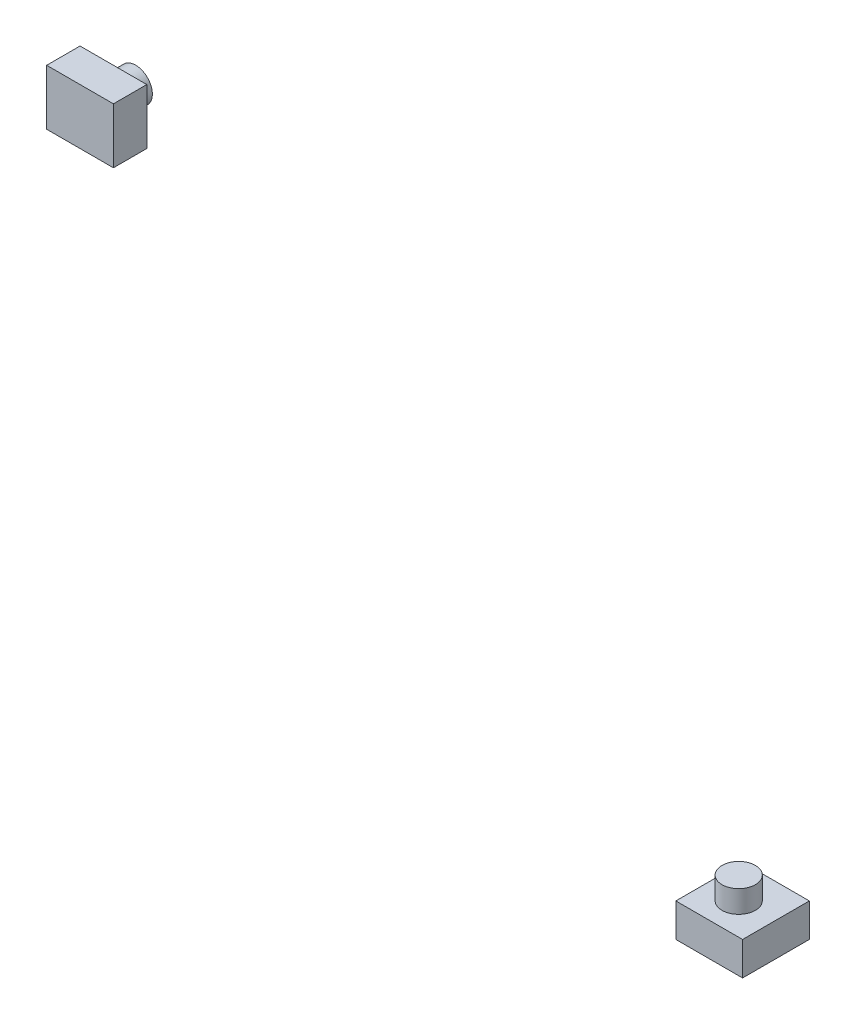
ISO-10303-21;
HEADER;
FILE_DESCRIPTION(('STEP AP214'),'2;1');
FILE_NAME('part.step','',(''),(''),'','','');
FILE_SCHEMA(('AUTOMOTIVE_DESIGN { 1 0 10303 214 1 1 1 1 }'));
ENDSEC;
DATA;
#1=APPLICATION_CONTEXT('core data for automotive mechanical design processes');
#2=APPLICATION_PROTOCOL_DEFINITION('international standard','automotive_design',2000,#1);
#3=PRODUCT_CONTEXT('',#1,'mechanical');
#4=PRODUCT('Part','Part','',(#3));
#5=PRODUCT_RELATED_PRODUCT_CATEGORY('part','',(#4));
#6=PRODUCT_DEFINITION_FORMATION('','',#4);
#7=PRODUCT_DEFINITION_CONTEXT('part definition',#1,'design');
#8=PRODUCT_DEFINITION('design','',#6,#7);
#9=PRODUCT_DEFINITION_SHAPE('','',#8);
#10=(LENGTH_UNIT() NAMED_UNIT(*) SI_UNIT(.MILLI.,.METRE.));
#11=(NAMED_UNIT(*) PLANE_ANGLE_UNIT() SI_UNIT($,.RADIAN.));
#12=(NAMED_UNIT(*) SI_UNIT($,.STERADIAN.) SOLID_ANGLE_UNIT());
#13=UNCERTAINTY_MEASURE_WITH_UNIT(LENGTH_MEASURE(1.E-05),#10,'distance_accuracy_value','');
#14=(GEOMETRIC_REPRESENTATION_CONTEXT(3) GLOBAL_UNCERTAINTY_ASSIGNED_CONTEXT((#13)) GLOBAL_UNIT_ASSIGNED_CONTEXT((#10,
#11,#12)) REPRESENTATION_CONTEXT('',''));
#15=CARTESIAN_POINT('',(0.,0.,0.));
#16=DIRECTION('',(0.,0.,1.));
#17=DIRECTION('',(1.,0.,0.));
#18=AXIS2_PLACEMENT_3D('',#15,#16,#17);
#19=CARTESIAN_POINT('',(-533.4,29.4639999999999,-176.53));
#20=DIRECTION('',(0.,0.,-1.));
#21=DIRECTION('',(-1.,0.,0.));
#22=AXIS2_PLACEMENT_3D('',#19,#20,#21);
#23=CYLINDRICAL_SURFACE('',#22,9.52500000000002);
#24=CARTESIAN_POINT('',(-533.4,29.4639999999999,-176.53));
#25=DIRECTION('',(0.,0.,1.));
#26=DIRECTION('',(1.,0.,0.));
#27=AXIS2_PLACEMENT_3D('',#24,#25,#26);
#28=CIRCLE('',#27,9.52500000000002);
#29=CARTESIAN_POINT('',(-523.875,29.4639999999999,-176.53));
#30=VERTEX_POINT('',#29);
#31=EDGE_CURVE('E12',#30,#30,#28,.T.);
#32=ORIENTED_EDGE('',*,*,#31,.F.);
#33=EDGE_LOOP('',(#32));
#34=FACE_BOUND('',#33,.T.);
#35=CARTESIAN_POINT('',(-533.4,29.4639999999999,-189.23));
#36=DIRECTION('',(0.,0.,1.));
#37=DIRECTION('',(1.,0.,0.));
#38=AXIS2_PLACEMENT_3D('',#35,#36,#37);
#39=CIRCLE('',#38,9.52500000000002);
#40=CARTESIAN_POINT('',(-523.875,29.4639999999999,-189.23));
#41=VERTEX_POINT('',#40);
#42=EDGE_CURVE('E44',#41,#41,#39,.T.);
#43=ORIENTED_EDGE('',*,*,#42,.T.);
#44=EDGE_LOOP('',(#43));
#45=FACE_BOUND('',#44,.T.);
#46=ADVANCED_FACE('F41',(#34,#45),#23,.T.);
#47=CARTESIAN_POINT('',(-533.4,29.4639999999999,-189.23));
#48=DIRECTION('',(0.,0.,1.));
#49=DIRECTION('',(1.,0.,0.));
#50=AXIS2_PLACEMENT_3D('',#47,#48,#49);
#51=PLANE('',#50);
#52=ORIENTED_EDGE('',*,*,#42,.F.);
#53=EDGE_LOOP('',(#52));
#54=FACE_BOUND('',#53,.T.);
#55=ADVANCED_FACE('F120',(#54),#51,.F.);
#56=CARTESIAN_POINT('',(-514.35,13.6466217693397,-176.53));
#57=DIRECTION('',(0.,0.,1.));
#58=DIRECTION('',(1.,0.,0.));
#59=AXIS2_PLACEMENT_3D('',#56,#57,#58);
#60=PLANE('',#59);
#61=DIRECTION('',(0.,1.,0.));
#62=VECTOR('',#61,1.);
#63=CARTESIAN_POINT('',(-514.35,45.2813782306603,-176.53));
#64=LINE('',#63,#62);
#65=CARTESIAN_POINT('',(-514.35,13.6466217693397,-176.53));
#66=VERTEX_POINT('',#65);
#67=CARTESIAN_POINT('',(-514.35,45.2813782306603,-176.53));
#68=VERTEX_POINT('',#67);
#69=EDGE_CURVE('E108',#66,#68,#64,.T.);
#70=ORIENTED_EDGE('',*,*,#69,.F.);
#71=DIRECTION('',(1.,0.,0.));
#72=VECTOR('',#71,1.);
#73=CARTESIAN_POINT('',(-552.45,13.6466217693397,-176.53));
#74=LINE('',#73,#72);
#75=CARTESIAN_POINT('',(-552.45,13.6466217693397,-176.53));
#76=VERTEX_POINT('',#75);
#77=EDGE_CURVE('E80',#76,#66,#74,.T.);
#78=ORIENTED_EDGE('',*,*,#77,.F.);
#79=DIRECTION('',(0.,-1.,0.));
#80=VECTOR('',#79,1.);
#81=CARTESIAN_POINT('',(-552.45,45.2813782306603,-176.53));
#82=LINE('',#81,#80);
#83=CARTESIAN_POINT('',(-552.45,45.2813782306603,-176.53));
#84=VERTEX_POINT('',#83);
#85=EDGE_CURVE('E74',#84,#76,#82,.T.);
#86=ORIENTED_EDGE('',*,*,#85,.F.);
#87=DIRECTION('',(-1.,0.,0.));
#88=VECTOR('',#87,1.);
#89=CARTESIAN_POINT('',(-552.45,45.2813782306603,-176.53));
#90=LINE('',#89,#88);
#91=EDGE_CURVE('E98',#68,#84,#90,.T.);
#92=ORIENTED_EDGE('',*,*,#91,.F.);
#93=EDGE_LOOP('',(#70,#78,#86,#92));
#94=FACE_BOUND('',#93,.T.);
#95=ORIENTED_EDGE('',*,*,#31,.T.);
#96=EDGE_LOOP('',(#95));
#97=FACE_BOUND('',#96,.T.);
#98=ADVANCED_FACE('F122',(#94,#97),#60,.F.);
#99=CARTESIAN_POINT('',(-514.35,45.2813782306603,-157.48));
#100=DIRECTION('',(-1.,0.,0.));
#101=DIRECTION('',(0.,0.,1.));
#102=AXIS2_PLACEMENT_3D('',#99,#100,#101);
#103=PLANE('',#102);
#104=ORIENTED_EDGE('',*,*,#69,.T.);
#105=DIRECTION('',(0.,0.,-1.));
#106=VECTOR('',#105,1.);
#107=CARTESIAN_POINT('',(-514.35,45.2813782306603,-157.48));
#108=LINE('',#107,#106);
#109=CARTESIAN_POINT('',(-514.35,45.2813782306603,-157.48));
#110=VERTEX_POINT('',#109);
#111=EDGE_CURVE('E99',#110,#68,#108,.T.);
#112=ORIENTED_EDGE('',*,*,#111,.F.);
#113=DIRECTION('',(0.,1.,0.));
#114=VECTOR('',#113,1.);
#115=CARTESIAN_POINT('',(-514.35,45.2813782306603,-157.48));
#116=LINE('',#115,#114);
#117=CARTESIAN_POINT('',(-514.35,13.6466217693397,-157.48));
#118=VERTEX_POINT('',#117);
#119=EDGE_CURVE('E93',#118,#110,#116,.T.);
#120=ORIENTED_EDGE('',*,*,#119,.F.);
#121=DIRECTION('',(0.,0.,-1.));
#122=VECTOR('',#121,1.);
#123=CARTESIAN_POINT('',(-514.35,13.6466217693397,-157.48));
#124=LINE('',#123,#122);
#125=EDGE_CURVE('E104',#118,#66,#124,.T.);
#126=ORIENTED_EDGE('',*,*,#125,.T.);
#127=EDGE_LOOP('',(#104,#112,#120,#126));
#128=FACE_BOUND('',#127,.T.);
#129=ADVANCED_FACE('F127',(#128),#103,.F.);
#130=CARTESIAN_POINT('',(-552.45,45.2813782306603,-157.48));
#131=DIRECTION('',(0.,-1.,0.));
#132=DIRECTION('',(1.,0.,0.));
#133=AXIS2_PLACEMENT_3D('',#130,#131,#132);
#134=PLANE('',#133);
#135=ORIENTED_EDGE('',*,*,#91,.T.);
#136=DIRECTION('',(0.,0.,-1.));
#137=VECTOR('',#136,1.);
#138=CARTESIAN_POINT('',(-552.45,45.2813782306603,-157.48));
#139=LINE('',#138,#137);
#140=CARTESIAN_POINT('',(-552.45,45.2813782306603,-157.48));
#141=VERTEX_POINT('',#140);
#142=EDGE_CURVE('E96',#141,#84,#139,.T.);
#143=ORIENTED_EDGE('',*,*,#142,.F.);
#144=DIRECTION('',(-1.,0.,0.));
#145=VECTOR('',#144,1.);
#146=CARTESIAN_POINT('',(-552.45,45.2813782306603,-157.48));
#147=LINE('',#146,#145);
#148=EDGE_CURVE('E88',#110,#141,#147,.T.);
#149=ORIENTED_EDGE('',*,*,#148,.F.);
#150=ORIENTED_EDGE('',*,*,#111,.T.);
#151=EDGE_LOOP('',(#135,#143,#149,#150));
#152=FACE_BOUND('',#151,.T.);
#153=ADVANCED_FACE('F97',(#152),#134,.F.);
#154=CARTESIAN_POINT('',(-552.45,45.2813782306603,-157.48));
#155=DIRECTION('',(1.,0.,0.));
#156=DIRECTION('',(0.,0.,-1.));
#157=AXIS2_PLACEMENT_3D('',#154,#155,#156);
#158=PLANE('',#157);
#159=ORIENTED_EDGE('',*,*,#85,.T.);
#160=DIRECTION('',(0.,0.,-1.));
#161=VECTOR('',#160,1.);
#162=CARTESIAN_POINT('',(-552.45,13.6466217693397,-157.48));
#163=LINE('',#162,#161);
#164=CARTESIAN_POINT('',(-552.45,13.6466217693397,-157.48));
#165=VERTEX_POINT('',#164);
#166=EDGE_CURVE('E100',#165,#76,#163,.T.);
#167=ORIENTED_EDGE('',*,*,#166,.F.);
#168=DIRECTION('',(0.,-1.,0.));
#169=VECTOR('',#168,1.);
#170=CARTESIAN_POINT('',(-552.45,45.2813782306603,-157.48));
#171=LINE('',#170,#169);
#172=EDGE_CURVE('E91',#141,#165,#171,.T.);
#173=ORIENTED_EDGE('',*,*,#172,.F.);
#174=ORIENTED_EDGE('',*,*,#142,.T.);
#175=EDGE_LOOP('',(#159,#167,#173,#174));
#176=FACE_BOUND('',#175,.T.);
#177=ADVANCED_FACE('F102',(#176),#158,.F.);
#178=CARTESIAN_POINT('',(-552.45,13.6466217693397,-157.48));
#179=DIRECTION('',(0.,1.,0.));
#180=DIRECTION('',(0.,0.,1.));
#181=AXIS2_PLACEMENT_3D('',#178,#179,#180);
#182=PLANE('',#181);
#183=ORIENTED_EDGE('',*,*,#77,.T.);
#184=ORIENTED_EDGE('',*,*,#125,.F.);
#185=DIRECTION('',(1.,0.,0.));
#186=VECTOR('',#185,1.);
#187=CARTESIAN_POINT('',(-552.45,13.6466217693397,-157.48));
#188=LINE('',#187,#186);
#189=EDGE_CURVE('E57',#165,#118,#188,.T.);
#190=ORIENTED_EDGE('',*,*,#189,.F.);
#191=ORIENTED_EDGE('',*,*,#166,.T.);
#192=EDGE_LOOP('',(#183,#184,#190,#191));
#193=FACE_BOUND('',#192,.T.);
#194=ADVANCED_FACE('F139',(#193),#182,.F.);
#195=CARTESIAN_POINT('',(-514.35,13.6466217693397,-157.48));
#196=DIRECTION('',(0.,0.,1.));
#197=DIRECTION('',(1.,0.,0.));
#198=AXIS2_PLACEMENT_3D('',#195,#196,#197);
#199=PLANE('',#198);
#200=ORIENTED_EDGE('',*,*,#119,.T.);
#201=ORIENTED_EDGE('',*,*,#148,.T.);
#202=ORIENTED_EDGE('',*,*,#172,.T.);
#203=ORIENTED_EDGE('',*,*,#189,.T.);
#204=EDGE_LOOP('',(#200,#201,#202,#203));
#205=FACE_BOUND('',#204,.T.);
#206=ADVANCED_FACE('F89',(#205),#199,.T.);
#207=CLOSED_SHELL('',(#46,#55,#98,#129,#153,#177,#194,#206));
#208=MANIFOLD_SOLID_BREP('B2',#207);
#209=CARTESIAN_POINT('',(0.,-12.7,0.));
#210=DIRECTION('',(0.,1.,0.));
#211=DIRECTION('',(0.,0.,1.));
#212=AXIS2_PLACEMENT_3D('',#209,#210,#211);
#213=CYLINDRICAL_SURFACE('',#212,9.525);
#214=CARTESIAN_POINT('',(0.,-12.7,0.));
#215=DIRECTION('',(0.,-1.,0.));
#216=DIRECTION('',(0.,0.,-1.));
#217=AXIS2_PLACEMENT_3D('',#214,#215,#216);
#218=CIRCLE('',#217,9.525);
#219=CARTESIAN_POINT('',(0.,-12.7,-9.525));
#220=VERTEX_POINT('',#219);
#221=EDGE_CURVE('E203',#220,#220,#218,.F.);
#222=ORIENTED_EDGE('',*,*,#221,.T.);
#223=EDGE_LOOP('',(#222));
#224=FACE_BOUND('',#223,.T.);
#225=CARTESIAN_POINT('',(0.,0.,0.));
#226=DIRECTION('',(0.,1.,0.));
#227=DIRECTION('',(0.,0.,1.));
#228=AXIS2_PLACEMENT_3D('',#225,#226,#227);
#229=CIRCLE('',#228,9.525);
#230=CARTESIAN_POINT('',(0.,0.,9.525));
#231=VERTEX_POINT('',#230);
#232=EDGE_CURVE('E39',#231,#231,#229,.T.);
#233=ORIENTED_EDGE('',*,*,#232,.F.);
#234=EDGE_LOOP('',(#233));
#235=FACE_BOUND('',#234,.T.);
#236=ADVANCED_FACE('F195',(#224,#235),#213,.T.);
#237=CARTESIAN_POINT('',(0.,0.,0.));
#238=DIRECTION('',(0.,1.,0.));
#239=DIRECTION('',(0.,0.,1.));
#240=AXIS2_PLACEMENT_3D('',#237,#238,#239);
#241=PLANE('',#240);
#242=ORIENTED_EDGE('',*,*,#232,.T.);
#243=EDGE_LOOP('',(#242));
#244=FACE_BOUND('',#243,.T.);
#245=ADVANCED_FACE('F292',(#244),#241,.T.);
#246=CARTESIAN_POINT('',(20.2418351148613,-31.75,18.0318031492346));
#247=DIRECTION('',(-1.,0.,0.));
#248=DIRECTION('',(0.,0.,1.));
#249=AXIS2_PLACEMENT_3D('',#246,#247,#248);
#250=PLANE('',#249);
#251=DIRECTION('',(0.,0.,1.));
#252=VECTOR('',#251,1.);
#253=CARTESIAN_POINT('',(20.2418351148613,-12.7,18.0318031492346));
#254=LINE('',#253,#252);
#255=CARTESIAN_POINT('',(20.2418351148613,-12.7,-20.0681968507654));
#256=VERTEX_POINT('',#255);
#257=CARTESIAN_POINT('',(20.2418351148613,-12.7,18.0318031492346));
#258=VERTEX_POINT('',#257);
#259=EDGE_CURVE('E262',#256,#258,#254,.T.);
#260=ORIENTED_EDGE('',*,*,#259,.T.);
#261=DIRECTION('',(0.,1.,0.));
#262=VECTOR('',#261,1.);
#263=CARTESIAN_POINT('',(20.2418351148613,-31.75,18.0318031492346));
#264=LINE('',#263,#262);
#265=CARTESIAN_POINT('',(20.2418351148613,-31.75,18.0318031492346));
#266=VERTEX_POINT('',#265);
#267=EDGE_CURVE('E253',#266,#258,#264,.T.);
#268=ORIENTED_EDGE('',*,*,#267,.F.);
#269=DIRECTION('',(0.,0.,1.));
#270=VECTOR('',#269,1.);
#271=CARTESIAN_POINT('',(20.2418351148613,-31.75,18.0318031492346));
#272=LINE('',#271,#270);
#273=CARTESIAN_POINT('',(20.2418351148613,-31.75,-20.0681968507654));
#274=VERTEX_POINT('',#273);
#275=EDGE_CURVE('E247',#274,#266,#272,.T.);
#276=ORIENTED_EDGE('',*,*,#275,.F.);
#277=DIRECTION('',(0.,1.,0.));
#278=VECTOR('',#277,1.);
#279=CARTESIAN_POINT('',(20.2418351148613,-31.75,-20.0681968507654));
#280=LINE('',#279,#278);
#281=EDGE_CURVE('E258',#274,#256,#280,.T.);
#282=ORIENTED_EDGE('',*,*,#281,.T.);
#283=EDGE_LOOP('',(#260,#268,#276,#282));
#284=FACE_BOUND('',#283,.T.);
#285=ADVANCED_FACE('F281',(#284),#250,.F.);
#286=CARTESIAN_POINT('',(-17.8581648851387,-31.75,18.0318031492346));
#287=DIRECTION('',(0.,0.,-1.));
#288=DIRECTION('',(-1.,0.,0.));
#289=AXIS2_PLACEMENT_3D('',#286,#287,#288);
#290=PLANE('',#289);
#291=DIRECTION('',(-1.,0.,0.));
#292=VECTOR('',#291,1.);
#293=CARTESIAN_POINT('',(-17.8581648851387,-12.7,18.0318031492346));
#294=LINE('',#293,#292);
#295=CARTESIAN_POINT('',(-17.8581648851387,-12.7,18.0318031492346));
#296=VERTEX_POINT('',#295);
#297=EDGE_CURVE('E252',#258,#296,#294,.T.);
#298=ORIENTED_EDGE('',*,*,#297,.T.);
#299=DIRECTION('',(0.,1.,0.));
#300=VECTOR('',#299,1.);
#301=CARTESIAN_POINT('',(-17.8581648851387,-31.75,18.0318031492346));
#302=LINE('',#301,#300);
#303=CARTESIAN_POINT('',(-17.8581648851387,-31.75,18.0318031492346));
#304=VERTEX_POINT('',#303);
#305=EDGE_CURVE('E250',#304,#296,#302,.T.);
#306=ORIENTED_EDGE('',*,*,#305,.F.);
#307=DIRECTION('',(-1.,0.,0.));
#308=VECTOR('',#307,1.);
#309=CARTESIAN_POINT('',(-17.8581648851387,-31.75,18.0318031492346));
#310=LINE('',#309,#308);
#311=EDGE_CURVE('E242',#266,#304,#310,.T.);
#312=ORIENTED_EDGE('',*,*,#311,.F.);
#313=ORIENTED_EDGE('',*,*,#267,.T.);
#314=EDGE_LOOP('',(#298,#306,#312,#313));
#315=FACE_BOUND('',#314,.T.);
#316=ADVANCED_FACE('F251',(#315),#290,.F.);
#317=CARTESIAN_POINT('',(-17.8581648851387,-31.75,18.0318031492346));
#318=DIRECTION('',(1.,0.,0.));
#319=DIRECTION('',(0.,0.,-1.));
#320=AXIS2_PLACEMENT_3D('',#317,#318,#319);
#321=PLANE('',#320);
#322=DIRECTION('',(0.,0.,-1.));
#323=VECTOR('',#322,1.);
#324=CARTESIAN_POINT('',(-17.8581648851387,-12.7,18.0318031492346));
#325=LINE('',#324,#323);
#326=CARTESIAN_POINT('',(-17.8581648851387,-12.7,-20.0681968507654));
#327=VERTEX_POINT('',#326);
#328=EDGE_CURVE('E228',#296,#327,#325,.T.);
#329=ORIENTED_EDGE('',*,*,#328,.T.);
#330=DIRECTION('',(0.,1.,0.));
#331=VECTOR('',#330,1.);
#332=CARTESIAN_POINT('',(-17.8581648851387,-31.75,-20.0681968507654));
#333=LINE('',#332,#331);
#334=CARTESIAN_POINT('',(-17.8581648851387,-31.75,-20.0681968507654));
#335=VERTEX_POINT('',#334);
#336=EDGE_CURVE('E254',#335,#327,#333,.T.);
#337=ORIENTED_EDGE('',*,*,#336,.F.);
#338=DIRECTION('',(0.,0.,-1.));
#339=VECTOR('',#338,1.);
#340=CARTESIAN_POINT('',(-17.8581648851387,-31.75,18.0318031492346));
#341=LINE('',#340,#339);
#342=EDGE_CURVE('E245',#304,#335,#341,.T.);
#343=ORIENTED_EDGE('',*,*,#342,.F.);
#344=ORIENTED_EDGE('',*,*,#305,.T.);
#345=EDGE_LOOP('',(#329,#337,#343,#344));
#346=FACE_BOUND('',#345,.T.);
#347=ADVANCED_FACE('F256',(#346),#321,.F.);
#348=CARTESIAN_POINT('',(-17.8581648851387,-31.75,-20.0681968507654));
#349=DIRECTION('',(0.,0.,1.));
#350=DIRECTION('',(1.,0.,0.));
#351=AXIS2_PLACEMENT_3D('',#348,#349,#350);
#352=PLANE('',#351);
#353=DIRECTION('',(1.,0.,0.));
#354=VECTOR('',#353,1.);
#355=CARTESIAN_POINT('',(-17.8581648851387,-12.7,-20.0681968507654));
#356=LINE('',#355,#354);
#357=EDGE_CURVE('E234',#327,#256,#356,.T.);
#358=ORIENTED_EDGE('',*,*,#357,.T.);
#359=ORIENTED_EDGE('',*,*,#281,.F.);
#360=DIRECTION('',(1.,0.,0.));
#361=VECTOR('',#360,1.);
#362=CARTESIAN_POINT('',(-17.8581648851387,-31.75,-20.0681968507654));
#363=LINE('',#362,#361);
#364=EDGE_CURVE('E211',#335,#274,#363,.T.);
#365=ORIENTED_EDGE('',*,*,#364,.F.);
#366=ORIENTED_EDGE('',*,*,#336,.T.);
#367=EDGE_LOOP('',(#358,#359,#365,#366));
#368=FACE_BOUND('',#367,.T.);
#369=ADVANCED_FACE('F282',(#368),#352,.F.);
#370=CARTESIAN_POINT('',(20.2418351148613,-31.75,-20.0681968507654));
#371=DIRECTION('',(0.,-1.,0.));
#372=DIRECTION('',(0.,0.,-1.));
#373=AXIS2_PLACEMENT_3D('',#370,#371,#372);
#374=PLANE('',#373);
#375=ORIENTED_EDGE('',*,*,#275,.T.);
#376=ORIENTED_EDGE('',*,*,#311,.T.);
#377=ORIENTED_EDGE('',*,*,#342,.T.);
#378=ORIENTED_EDGE('',*,*,#364,.T.);
#379=EDGE_LOOP('',(#375,#376,#377,#378));
#380=FACE_BOUND('',#379,.T.);
#381=ADVANCED_FACE('F243',(#380),#374,.T.);
#382=CARTESIAN_POINT('',(20.2418351148613,-12.7,-20.0681968507654));
#383=DIRECTION('',(0.,-1.,0.));
#384=DIRECTION('',(0.,0.,-1.));
#385=AXIS2_PLACEMENT_3D('',#382,#383,#384);
#386=PLANE('',#385);
#387=ORIENTED_EDGE('',*,*,#221,.F.);
#388=EDGE_LOOP('',(#387));
#389=FACE_BOUND('',#388,.T.);
#390=ORIENTED_EDGE('',*,*,#259,.F.);
#391=ORIENTED_EDGE('',*,*,#357,.F.);
#392=ORIENTED_EDGE('',*,*,#328,.F.);
#393=ORIENTED_EDGE('',*,*,#297,.F.);
#394=EDGE_LOOP('',(#390,#391,#392,#393));
#395=FACE_BOUND('',#394,.T.);
#396=ADVANCED_FACE('F275',(#389,#395),#386,.F.);
#397=CLOSED_SHELL('',(#236,#245,#285,#316,#347,#369,#381,#396));
#398=MANIFOLD_SOLID_BREP('B6',#397);
#399=ADVANCED_BREP_SHAPE_REPRESENTATION('',(#18,#208,#398),#14);
#400=SHAPE_DEFINITION_REPRESENTATION(#9,#399);
ENDSEC;
END-ISO-10303-21;
